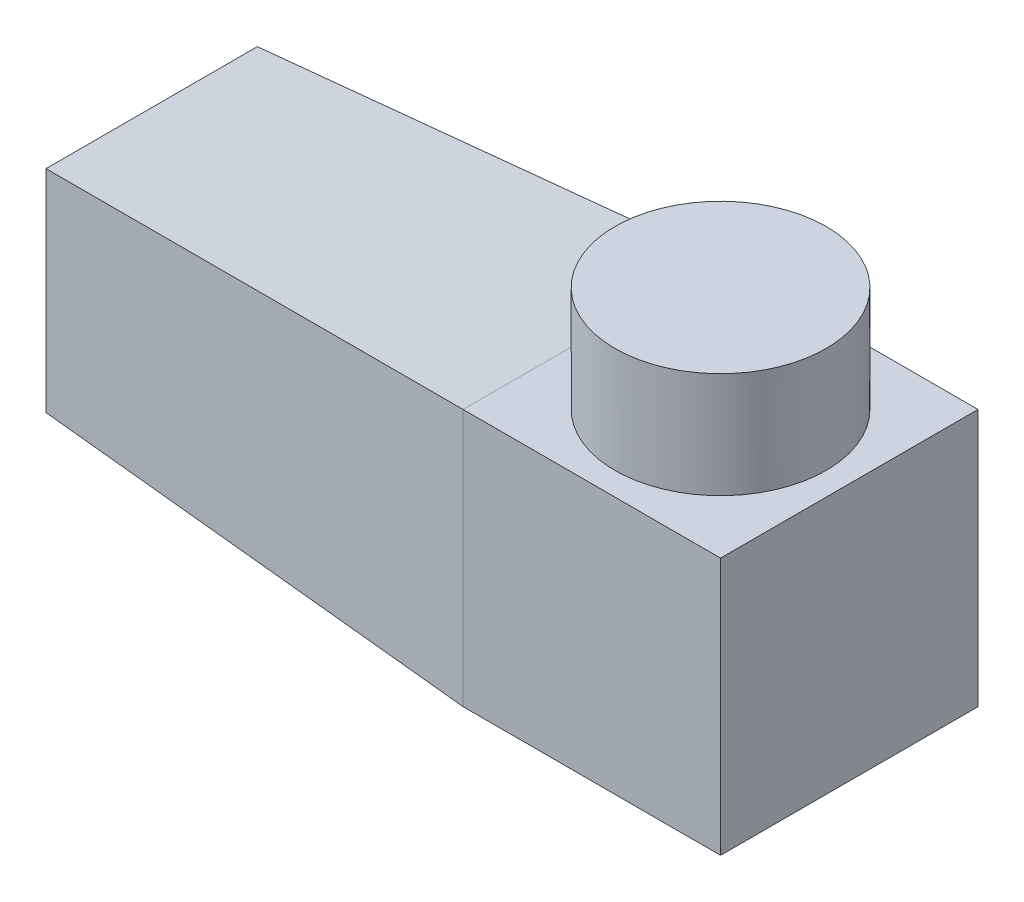
ISO-10303-21;
HEADER;
FILE_DESCRIPTION(('STEP AP214'),'2;1');
FILE_NAME('part.step','',(''),(''),'','','');
FILE_SCHEMA(('AUTOMOTIVE_DESIGN { 1 0 10303 214 1 1 1 1 }'));
ENDSEC;
DATA;
#1=APPLICATION_CONTEXT('core data for automotive mechanical design processes');
#2=APPLICATION_PROTOCOL_DEFINITION('international standard','automotive_design',2000,#1);
#3=PRODUCT_CONTEXT('',#1,'mechanical');
#4=PRODUCT('Part','Part','',(#3));
#5=PRODUCT_RELATED_PRODUCT_CATEGORY('part','',(#4));
#6=PRODUCT_DEFINITION_FORMATION('','',#4);
#7=PRODUCT_DEFINITION_CONTEXT('part definition',#1,'design');
#8=PRODUCT_DEFINITION('design','',#6,#7);
#9=PRODUCT_DEFINITION_SHAPE('','',#8);
#10=(LENGTH_UNIT() NAMED_UNIT(*) SI_UNIT(.MILLI.,.METRE.));
#11=(NAMED_UNIT(*) PLANE_ANGLE_UNIT() SI_UNIT($,.RADIAN.));
#12=(NAMED_UNIT(*) SI_UNIT($,.STERADIAN.) SOLID_ANGLE_UNIT());
#13=UNCERTAINTY_MEASURE_WITH_UNIT(LENGTH_MEASURE(1.E-05),#10,'distance_accuracy_value','');
#14=(GEOMETRIC_REPRESENTATION_CONTEXT(3) GLOBAL_UNCERTAINTY_ASSIGNED_CONTEXT((#13)) GLOBAL_UNIT_ASSIGNED_CONTEXT((#10,
#11,#12)) REPRESENTATION_CONTEXT('',''));
#15=CARTESIAN_POINT('',(0.,0.,0.));
#16=DIRECTION('',(0.,0.,1.));
#17=DIRECTION('',(1.,0.,0.));
#18=AXIS2_PLACEMENT_3D('',#15,#16,#17);
#19=CARTESIAN_POINT('',(396.2,73.1019448207603,-73.1019448207604));
#20=DIRECTION('',(0.,-1.,0.));
#21=DIRECTION('',(0.,0.,-1.));
#22=AXIS2_PLACEMENT_3D('',#19,#20,#21);
#23=PLANE('',#22);
#24=DIRECTION('',(0.,0.,-1.));
#25=VECTOR('',#24,1.);
#26=CARTESIAN_POINT('',(250.,73.1019448207603,60.));
#27=LINE('',#26,#25);
#28=CARTESIAN_POINT('',(250.,73.1019448207603,-73.1019448207604));
#29=VERTEX_POINT('',#28);
#30=CARTESIAN_POINT('',(250.,73.1019448207603,73.1019448207604));
#31=VERTEX_POINT('',#30);
#32=EDGE_CURVE('E110',#29,#31,#27,.F.);
#33=ORIENTED_EDGE('',*,*,#32,.T.);
#34=DIRECTION('',(-1.,0.,0.));
#35=VECTOR('',#34,1.);
#36=CARTESIAN_POINT('',(396.2,73.1019448207603,73.1019448207604));
#37=LINE('',#36,#35);
#38=CARTESIAN_POINT('',(396.2,73.1019448207603,73.1019448207604));
#39=VERTEX_POINT('',#38);
#40=EDGE_CURVE('E91',#39,#31,#37,.T.);
#41=ORIENTED_EDGE('',*,*,#40,.F.);
#42=DIRECTION('',(0.,0.,1.));
#43=VECTOR('',#42,1.);
#44=CARTESIAN_POINT('',(396.2,73.1019448207603,-73.1019448207604));
#45=LINE('',#44,#43);
#46=CARTESIAN_POINT('',(396.2,73.1019448207603,-73.1019448207604));
#47=VERTEX_POINT('',#46);
#48=EDGE_CURVE('E98',#47,#39,#45,.T.);
#49=ORIENTED_EDGE('',*,*,#48,.F.);
#50=DIRECTION('',(-1.,0.,0.));
#51=VECTOR('',#50,1.);
#52=CARTESIAN_POINT('',(396.2,73.1019448207603,-73.1019448207604));
#53=LINE('',#52,#51);
#54=EDGE_CURVE('E142',#47,#29,#53,.T.);
#55=ORIENTED_EDGE('',*,*,#54,.T.);
#56=EDGE_LOOP('',(#33,#41,#49,#55));
#57=FACE_BOUND('',#56,.T.);
#58=CARTESIAN_POINT('',(323.1,73.1019448207603,0.));
#59=DIRECTION('',(0.,-1.,0.));
#60=DIRECTION('',(0.,0.,-1.));
#61=AXIS2_PLACEMENT_3D('',#58,#59,#60);
#62=CIRCLE('',#61,60.);
#63=CARTESIAN_POINT('',(323.1,73.1019448207603,-60.));
#64=VERTEX_POINT('',#63);
#65=EDGE_CURVE('E11',#64,#64,#62,.F.);
#66=ORIENTED_EDGE('',*,*,#65,.F.);
#67=EDGE_LOOP('',(#66));
#68=FACE_BOUND('',#67,.T.);
#69=ADVANCED_FACE('F33',(#57,#68),#23,.F.);
#70=CARTESIAN_POINT('',(0.,60.,60.));
#71=DIRECTION('',(-0.0523359562429439,0.,0.998629534754574));
#72=DIRECTION('',(0.998629534754574,0.,0.052335956242944));
#73=AXIS2_PLACEMENT_3D('',#70,#71,#72);
#74=PLANE('',#73);
#75=DIRECTION('',(0.,-1.,0.));
#76=VECTOR('',#75,1.);
#77=CARTESIAN_POINT('',(0.,60.,60.));
#78=LINE('',#77,#76);
#79=CARTESIAN_POINT('',(0.,60.,60.));
#80=VERTEX_POINT('',#79);
#81=CARTESIAN_POINT('',(0.,-60.,60.));
#82=VERTEX_POINT('',#81);
#83=EDGE_CURVE('E111',#80,#82,#78,.T.);
#84=ORIENTED_EDGE('',*,*,#83,.T.);
#85=DIRECTION('',(-0.997264688634237,0.052264427688714,-0.052264427688714));
#86=VECTOR('',#85,1.);
#87=CARTESIAN_POINT('',(0.,-60.,60.));
#88=LINE('',#87,#86);
#89=CARTESIAN_POINT('',(250.,-73.1019448207603,73.1019448207604));
#90=VERTEX_POINT('',#89);
#91=EDGE_CURVE('E41',#90,#82,#88,.T.);
#92=ORIENTED_EDGE('',*,*,#91,.F.);
#93=DIRECTION('',(0.,1.,0.));
#94=VECTOR('',#93,1.);
#95=CARTESIAN_POINT('',(250.,60.,73.1019448207604));
#96=LINE('',#95,#94);
#97=EDGE_CURVE('E125',#31,#90,#96,.F.);
#98=ORIENTED_EDGE('',*,*,#97,.F.);
#99=DIRECTION('',(-0.997264688634237,-0.052264427688714,-0.052264427688714));
#100=VECTOR('',#99,1.);
#101=CARTESIAN_POINT('',(0.,60.,60.));
#102=LINE('',#101,#100);
#103=EDGE_CURVE('E128',#31,#80,#102,.T.);
#104=ORIENTED_EDGE('',*,*,#103,.T.);
#105=EDGE_LOOP('',(#84,#92,#98,#104));
#106=FACE_BOUND('',#105,.T.);
#107=ADVANCED_FACE('F159',(#106),#74,.T.);
#108=CARTESIAN_POINT('',(0.,-60.,60.));
#109=DIRECTION('',(-0.0523359562429439,-0.998629534754574,0.));
#110=DIRECTION('',(0.998629534754574,-0.052335956242944,0.));
#111=AXIS2_PLACEMENT_3D('',#108,#109,#110);
#112=PLANE('',#111);
#113=DIRECTION('',(0.,0.,-1.));
#114=VECTOR('',#113,1.);
#115=CARTESIAN_POINT('',(0.,-60.,60.));
#116=LINE('',#115,#114);
#117=CARTESIAN_POINT('',(0.,-60.,-60.));
#118=VERTEX_POINT('',#117);
#119=EDGE_CURVE('E114',#82,#118,#116,.T.);
#120=ORIENTED_EDGE('',*,*,#119,.T.);
#121=DIRECTION('',(-0.997264688634237,0.052264427688714,0.052264427688714));
#122=VECTOR('',#121,1.);
#123=CARTESIAN_POINT('',(-6.25457618467584,-59.6722115518045,-59.6722115518046));
#124=LINE('',#123,#122);
#125=CARTESIAN_POINT('',(250.,-73.1019448207603,-73.1019448207604));
#126=VERTEX_POINT('',#125);
#127=EDGE_CURVE('E56',#126,#118,#124,.T.);
#128=ORIENTED_EDGE('',*,*,#127,.F.);
#129=DIRECTION('',(0.,0.,1.));
#130=VECTOR('',#129,1.);
#131=CARTESIAN_POINT('',(250.,-73.1019448207603,60.));
#132=LINE('',#131,#130);
#133=EDGE_CURVE('E134',#90,#126,#132,.F.);
#134=ORIENTED_EDGE('',*,*,#133,.F.);
#135=ORIENTED_EDGE('',*,*,#91,.T.);
#136=EDGE_LOOP('',(#120,#128,#134,#135));
#137=FACE_BOUND('',#136,.T.);
#138=ADVANCED_FACE('F35',(#137),#112,.T.);
#139=CARTESIAN_POINT('',(0.,60.,-60.));
#140=DIRECTION('',(-0.0523359562429439,0.,-0.998629534754574));
#141=DIRECTION('',(-0.998629534754574,0.,0.052335956242944));
#142=AXIS2_PLACEMENT_3D('',#139,#140,#141);
#143=PLANE('',#142);
#144=DIRECTION('',(0.,1.,0.));
#145=VECTOR('',#144,1.);
#146=CARTESIAN_POINT('',(0.,60.,-60.));
#147=LINE('',#146,#145);
#148=CARTESIAN_POINT('',(0.,60.,-60.));
#149=VERTEX_POINT('',#148);
#150=EDGE_CURVE('E121',#118,#149,#147,.T.);
#151=ORIENTED_EDGE('',*,*,#150,.T.);
#152=DIRECTION('',(-0.997264688634237,-0.052264427688714,0.052264427688714));
#153=VECTOR('',#152,1.);
#154=CARTESIAN_POINT('',(-6.25457618467584,59.6722115518045,-59.6722115518046));
#155=LINE('',#154,#153);
#156=EDGE_CURVE('E48',#29,#149,#155,.T.);
#157=ORIENTED_EDGE('',*,*,#156,.F.);
#158=DIRECTION('',(0.,-1.,0.));
#159=VECTOR('',#158,1.);
#160=CARTESIAN_POINT('',(250.,60.,-73.1019448207604));
#161=LINE('',#160,#159);
#162=EDGE_CURVE('E137',#126,#29,#161,.F.);
#163=ORIENTED_EDGE('',*,*,#162,.F.);
#164=ORIENTED_EDGE('',*,*,#127,.T.);
#165=EDGE_LOOP('',(#151,#157,#163,#164));
#166=FACE_BOUND('',#165,.T.);
#167=ADVANCED_FACE('F175',(#166),#143,.T.);
#168=CARTESIAN_POINT('',(0.,60.,60.));
#169=DIRECTION('',(-0.0523359562429439,0.998629534754574,0.));
#170=DIRECTION('',(-0.998629534754574,-0.052335956242944,0.));
#171=AXIS2_PLACEMENT_3D('',#168,#169,#170);
#172=PLANE('',#171);
#173=DIRECTION('',(0.,0.,1.));
#174=VECTOR('',#173,1.);
#175=CARTESIAN_POINT('',(0.,60.,60.));
#176=LINE('',#175,#174);
#177=EDGE_CURVE('E123',#149,#80,#176,.T.);
#178=ORIENTED_EDGE('',*,*,#177,.T.);
#179=ORIENTED_EDGE('',*,*,#103,.F.);
#180=ORIENTED_EDGE('',*,*,#32,.F.);
#181=ORIENTED_EDGE('',*,*,#156,.T.);
#182=EDGE_LOOP('',(#178,#179,#180,#181));
#183=FACE_BOUND('',#182,.T.);
#184=ADVANCED_FACE('F171',(#183),#172,.T.);
#185=CARTESIAN_POINT('',(0.,0.,0.));
#186=DIRECTION('',(1.,0.,0.));
#187=DIRECTION('',(0.,0.,-1.));
#188=AXIS2_PLACEMENT_3D('',#185,#186,#187);
#189=PLANE('',#188);
#190=ORIENTED_EDGE('',*,*,#83,.F.);
#191=ORIENTED_EDGE('',*,*,#177,.F.);
#192=ORIENTED_EDGE('',*,*,#150,.F.);
#193=ORIENTED_EDGE('',*,*,#119,.F.);
#194=EDGE_LOOP('',(#190,#191,#192,#193));
#195=FACE_BOUND('',#194,.T.);
#196=ADVANCED_FACE('F169',(#195),#189,.F.);
#197=CARTESIAN_POINT('',(396.2,73.1019448207603,73.1019448207604));
#198=DIRECTION('',(0.,0.,-1.));
#199=DIRECTION('',(-1.,0.,0.));
#200=AXIS2_PLACEMENT_3D('',#197,#198,#199);
#201=PLANE('',#200);
#202=ORIENTED_EDGE('',*,*,#97,.T.);
#203=DIRECTION('',(-1.,0.,0.));
#204=VECTOR('',#203,1.);
#205=CARTESIAN_POINT('',(396.2,-73.1019448207603,73.1019448207604));
#206=LINE('',#205,#204);
#207=CARTESIAN_POINT('',(396.2,-73.1019448207603,73.1019448207604));
#208=VERTEX_POINT('',#207);
#209=EDGE_CURVE('E94',#208,#90,#206,.T.);
#210=ORIENTED_EDGE('',*,*,#209,.F.);
#211=DIRECTION('',(0.,-1.,0.));
#212=VECTOR('',#211,1.);
#213=CARTESIAN_POINT('',(396.2,73.1019448207603,73.1019448207604));
#214=LINE('',#213,#212);
#215=EDGE_CURVE('E86',#39,#208,#214,.T.);
#216=ORIENTED_EDGE('',*,*,#215,.F.);
#217=ORIENTED_EDGE('',*,*,#40,.T.);
#218=EDGE_LOOP('',(#202,#210,#216,#217));
#219=FACE_BOUND('',#218,.T.);
#220=ADVANCED_FACE('F89',(#219),#201,.F.);
#221=CARTESIAN_POINT('',(396.2,-73.1019448207603,73.1019448207604));
#222=DIRECTION('',(0.,1.,0.));
#223=DIRECTION('',(0.,0.,1.));
#224=AXIS2_PLACEMENT_3D('',#221,#222,#223);
#225=PLANE('',#224);
#226=ORIENTED_EDGE('',*,*,#133,.T.);
#227=DIRECTION('',(-1.,0.,0.));
#228=VECTOR('',#227,1.);
#229=CARTESIAN_POINT('',(396.2,-73.1019448207603,-73.1019448207604));
#230=LINE('',#229,#228);
#231=CARTESIAN_POINT('',(396.2,-73.1019448207603,-73.1019448207604));
#232=VERTEX_POINT('',#231);
#233=EDGE_CURVE('E116',#232,#126,#230,.T.);
#234=ORIENTED_EDGE('',*,*,#233,.F.);
#235=DIRECTION('',(0.,0.,-1.));
#236=VECTOR('',#235,1.);
#237=CARTESIAN_POINT('',(396.2,-73.1019448207603,73.1019448207604));
#238=LINE('',#237,#236);
#239=EDGE_CURVE('E97',#208,#232,#238,.T.);
#240=ORIENTED_EDGE('',*,*,#239,.F.);
#241=ORIENTED_EDGE('',*,*,#209,.T.);
#242=EDGE_LOOP('',(#226,#234,#240,#241));
#243=FACE_BOUND('',#242,.T.);
#244=ADVANCED_FACE('F187',(#243),#225,.F.);
#245=CARTESIAN_POINT('',(396.2,-73.1019448207603,-73.1019448207604));
#246=DIRECTION('',(0.,0.,1.));
#247=DIRECTION('',(1.,0.,0.));
#248=AXIS2_PLACEMENT_3D('',#245,#246,#247);
#249=PLANE('',#248);
#250=ORIENTED_EDGE('',*,*,#162,.T.);
#251=ORIENTED_EDGE('',*,*,#54,.F.);
#252=DIRECTION('',(0.,1.,0.));
#253=VECTOR('',#252,1.);
#254=CARTESIAN_POINT('',(396.2,-73.1019448207603,-73.1019448207604));
#255=LINE('',#254,#253);
#256=EDGE_CURVE('E103',#232,#47,#255,.T.);
#257=ORIENTED_EDGE('',*,*,#256,.F.);
#258=ORIENTED_EDGE('',*,*,#233,.T.);
#259=EDGE_LOOP('',(#250,#251,#257,#258));
#260=FACE_BOUND('',#259,.T.);
#261=ADVANCED_FACE('F141',(#260),#249,.F.);
#262=CARTESIAN_POINT('',(396.2,0.,0.));
#263=DIRECTION('',(1.,0.,0.));
#264=DIRECTION('',(0.,0.,-1.));
#265=AXIS2_PLACEMENT_3D('',#262,#263,#264);
#266=PLANE('',#265);
#267=ORIENTED_EDGE('',*,*,#48,.T.);
#268=ORIENTED_EDGE('',*,*,#215,.T.);
#269=ORIENTED_EDGE('',*,*,#239,.T.);
#270=ORIENTED_EDGE('',*,*,#256,.T.);
#271=EDGE_LOOP('',(#267,#268,#269,#270));
#272=FACE_BOUND('',#271,.T.);
#273=ADVANCED_FACE('F101',(#272),#266,.T.);
#274=CARTESIAN_POINT('',(323.1,133.10194482076,0.));
#275=DIRECTION('',(0.,-1.,0.));
#276=DIRECTION('',(0.,0.,-1.));
#277=AXIS2_PLACEMENT_3D('',#274,#275,#276);
#278=CYLINDRICAL_SURFACE('',#277,60.);
#279=CARTESIAN_POINT('',(323.1,133.10194482076,0.));
#280=DIRECTION('',(0.,1.,0.));
#281=DIRECTION('',(0.,0.,1.));
#282=AXIS2_PLACEMENT_3D('',#279,#280,#281);
#283=CIRCLE('',#282,60.);
#284=CARTESIAN_POINT('',(323.1,133.10194482076,60.));
#285=VERTEX_POINT('',#284);
#286=EDGE_CURVE('E107',#285,#285,#283,.T.);
#287=ORIENTED_EDGE('',*,*,#286,.F.);
#288=EDGE_LOOP('',(#287));
#289=FACE_BOUND('',#288,.T.);
#290=ORIENTED_EDGE('',*,*,#65,.T.);
#291=EDGE_LOOP('',(#290));
#292=FACE_BOUND('',#291,.T.);
#293=ADVANCED_FACE('F153',(#289,#292),#278,.T.);
#294=CARTESIAN_POINT('',(323.1,133.10194482076,0.));
#295=DIRECTION('',(0.,1.,0.));
#296=DIRECTION('',(0.,0.,1.));
#297=AXIS2_PLACEMENT_3D('',#294,#295,#296);
#298=PLANE('',#297);
#299=ORIENTED_EDGE('',*,*,#286,.T.);
#300=EDGE_LOOP('',(#299));
#301=FACE_BOUND('',#300,.T.);
#302=ADVANCED_FACE('F151',(#301),#298,.T.);
#303=CLOSED_SHELL('',(#69,#107,#138,#167,#184,#196,#220,#244,#261,#273,#293,#302));
#304=MANIFOLD_SOLID_BREP('B2',#303);
#305=ADVANCED_BREP_SHAPE_REPRESENTATION('',(#18,#304),#14);
#306=SHAPE_DEFINITION_REPRESENTATION(#9,#305);
ENDSEC;
END-ISO-10303-21;
